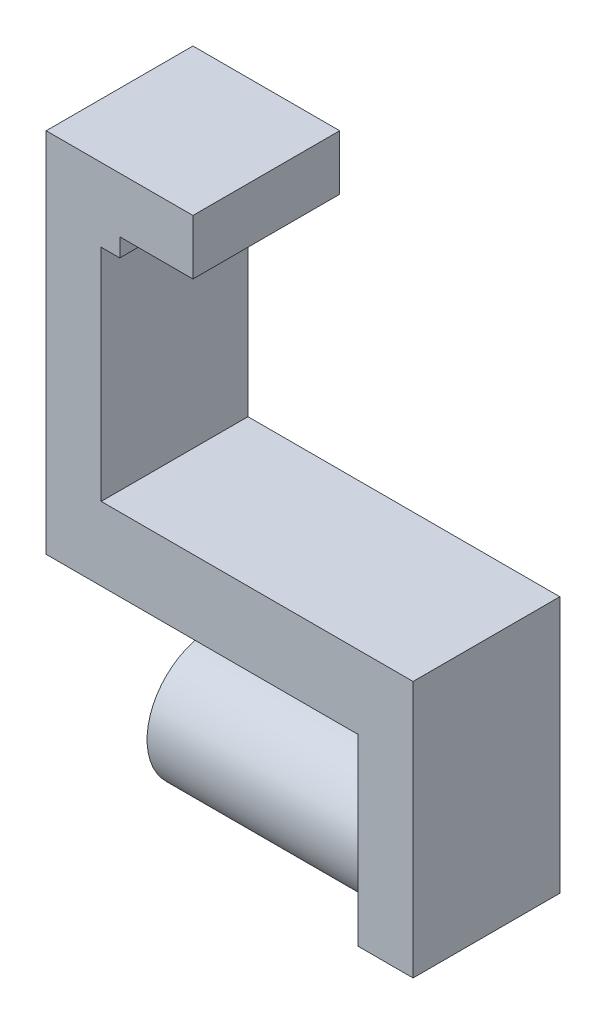
ISO-10303-21;
HEADER;
FILE_DESCRIPTION(('STEP AP214'),'2;1');
FILE_NAME('part.step','',(''),(''),'','','');
FILE_SCHEMA(('AUTOMOTIVE_DESIGN { 1 0 10303 214 1 1 1 1 }'));
ENDSEC;
DATA;
#1=APPLICATION_CONTEXT('core data for automotive mechanical design processes');
#2=APPLICATION_PROTOCOL_DEFINITION('international standard','automotive_design',2000,#1);
#3=PRODUCT_CONTEXT('',#1,'mechanical');
#4=PRODUCT('Part','Part','',(#3));
#5=PRODUCT_RELATED_PRODUCT_CATEGORY('part','',(#4));
#6=PRODUCT_DEFINITION_FORMATION('','',#4);
#7=PRODUCT_DEFINITION_CONTEXT('part definition',#1,'design');
#8=PRODUCT_DEFINITION('design','',#6,#7);
#9=PRODUCT_DEFINITION_SHAPE('','',#8);
#10=(LENGTH_UNIT() NAMED_UNIT(*) SI_UNIT(.MILLI.,.METRE.));
#11=(NAMED_UNIT(*) PLANE_ANGLE_UNIT() SI_UNIT($,.RADIAN.));
#12=(NAMED_UNIT(*) SI_UNIT($,.STERADIAN.) SOLID_ANGLE_UNIT());
#13=UNCERTAINTY_MEASURE_WITH_UNIT(LENGTH_MEASURE(1.E-05),#10,'distance_accuracy_value','');
#14=(GEOMETRIC_REPRESENTATION_CONTEXT(3) GLOBAL_UNCERTAINTY_ASSIGNED_CONTEXT((#13)) GLOBAL_UNIT_ASSIGNED_CONTEXT((#10,
#11,#12)) REPRESENTATION_CONTEXT('',''));
#15=CARTESIAN_POINT('',(0.,0.,0.));
#16=DIRECTION('',(0.,0.,1.));
#17=DIRECTION('',(1.,0.,0.));
#18=AXIS2_PLACEMENT_3D('',#15,#16,#17);
#19=CARTESIAN_POINT('',(-38.1,0.,0.));
#20=DIRECTION('',(1.,0.,0.));
#21=DIRECTION('',(0.,0.,-1.));
#22=AXIS2_PLACEMENT_3D('',#19,#20,#21);
#23=CYLINDRICAL_SURFACE('',#22,11.1125);
#24=CARTESIAN_POINT('',(-38.1,0.,0.));
#25=DIRECTION('',(1.,0.,0.));
#26=DIRECTION('',(0.,0.,-1.));
#27=AXIS2_PLACEMENT_3D('',#24,#25,#26);
#28=CIRCLE('',#27,11.1125);
#29=CARTESIAN_POINT('',(-38.1,0.,-11.1125));
#30=VERTEX_POINT('',#29);
#31=EDGE_CURVE('E237',#30,#30,#28,.T.);
#32=ORIENTED_EDGE('',*,*,#31,.T.);
#33=EDGE_LOOP('',(#32));
#34=FACE_BOUND('',#33,.T.);
#35=CARTESIAN_POINT('',(0.,0.,0.));
#36=DIRECTION('',(1.,0.,0.));
#37=DIRECTION('',(0.,0.,-1.));
#38=AXIS2_PLACEMENT_3D('',#35,#36,#37);
#39=CIRCLE('',#38,11.1125);
#40=CARTESIAN_POINT('',(0.,-11.1125,0.));
#41=VERTEX_POINT('',#40);
#42=EDGE_CURVE('E229',#41,#41,#39,.T.);
#43=ORIENTED_EDGE('',*,*,#42,.F.);
#44=EDGE_LOOP('',(#43));
#45=FACE_BOUND('',#44,.T.);
#46=ADVANCED_FACE('F50',(#34,#45),#23,.T.);
#47=CARTESIAN_POINT('',(-38.1,0.,0.));
#48=DIRECTION('',(1.,0.,0.));
#49=DIRECTION('',(0.,0.,-1.));
#50=AXIS2_PLACEMENT_3D('',#47,#48,#49);
#51=PLANE('',#50);
#52=ORIENTED_EDGE('',*,*,#31,.F.);
#53=EDGE_LOOP('',(#52));
#54=FACE_BOUND('',#53,.T.);
#55=ADVANCED_FACE('F277',(#54),#51,.F.);
#56=CARTESIAN_POINT('',(0.,-11.1125,-12.7));
#57=DIRECTION('',(-1.,0.,0.));
#58=DIRECTION('',(0.,0.,1.));
#59=AXIS2_PLACEMENT_3D('',#56,#57,#58);
#60=PLANE('',#59);
#61=DIRECTION('',(0.,0.,1.));
#62=VECTOR('',#61,1.);
#63=CARTESIAN_POINT('',(0.,-11.1125,-12.7));
#64=LINE('',#63,#62);
#65=CARTESIAN_POINT('',(0.,-11.1125,-12.7));
#66=VERTEX_POINT('',#65);
#67=EDGE_CURVE('E231',#66,#41,#64,.T.);
#68=ORIENTED_EDGE('',*,*,#67,.T.);
#69=ORIENTED_EDGE('',*,*,#42,.T.);
#70=CARTESIAN_POINT('',(0.,-11.1125,12.7));
#71=VERTEX_POINT('',#70);
#72=EDGE_CURVE('E228',#41,#71,#64,.T.);
#73=ORIENTED_EDGE('',*,*,#72,.T.);
#74=DIRECTION('',(0.,-1.,0.));
#75=VECTOR('',#74,1.);
#76=CARTESIAN_POINT('',(0.,-11.1125,12.7));
#77=LINE('',#76,#75);
#78=CARTESIAN_POINT('',(0.,20.6375,12.7));
#79=VERTEX_POINT('',#78);
#80=EDGE_CURVE('E208',#79,#71,#77,.T.);
#81=ORIENTED_EDGE('',*,*,#80,.F.);
#82=DIRECTION('',(0.,0.,1.));
#83=VECTOR('',#82,1.);
#84=CARTESIAN_POINT('',(0.,20.6375,-12.7));
#85=LINE('',#84,#83);
#86=CARTESIAN_POINT('',(0.,20.6375,-12.7));
#87=VERTEX_POINT('',#86);
#88=EDGE_CURVE('E230',#87,#79,#85,.T.);
#89=ORIENTED_EDGE('',*,*,#88,.F.);
#90=DIRECTION('',(0.,-1.,0.));
#91=VECTOR('',#90,1.);
#92=CARTESIAN_POINT('',(0.,-11.1125,-12.7));
#93=LINE('',#92,#91);
#94=EDGE_CURVE('E217',#87,#66,#93,.T.);
#95=ORIENTED_EDGE('',*,*,#94,.T.);
#96=EDGE_LOOP('',(#68,#69,#73,#81,#89,#95));
#97=FACE_BOUND('',#96,.T.);
#98=ADVANCED_FACE('F268',(#97),#60,.T.);
#99=CARTESIAN_POINT('',(9.525,-11.1125,-12.7));
#100=DIRECTION('',(1.,0.,0.));
#101=DIRECTION('',(0.,0.,-1.));
#102=AXIS2_PLACEMENT_3D('',#99,#100,#101);
#103=PLANE('',#102);
#104=DIRECTION('',(0.,1.,0.));
#105=VECTOR('',#104,1.);
#106=CARTESIAN_POINT('',(9.525,-11.1125,-12.7));
#107=LINE('',#106,#105);
#108=CARTESIAN_POINT('',(9.525,-11.1125,-12.7));
#109=VERTEX_POINT('',#108);
#110=CARTESIAN_POINT('',(9.525,33.3375,-12.7));
#111=VERTEX_POINT('',#110);
#112=EDGE_CURVE('E221',#109,#111,#107,.T.);
#113=ORIENTED_EDGE('',*,*,#112,.T.);
#114=DIRECTION('',(0.,0.,1.));
#115=VECTOR('',#114,1.);
#116=CARTESIAN_POINT('',(9.525,33.3375,-12.7));
#117=LINE('',#116,#115);
#118=CARTESIAN_POINT('',(9.525,33.3375,12.7));
#119=VERTEX_POINT('',#118);
#120=EDGE_CURVE('E202',#111,#119,#117,.T.);
#121=ORIENTED_EDGE('',*,*,#120,.T.);
#122=DIRECTION('',(0.,1.,0.));
#123=VECTOR('',#122,1.);
#124=CARTESIAN_POINT('',(9.525,-11.1125,12.7));
#125=LINE('',#124,#123);
#126=CARTESIAN_POINT('',(9.525,-11.1125,12.7));
#127=VERTEX_POINT('',#126);
#128=EDGE_CURVE('E216',#127,#119,#125,.T.);
#129=ORIENTED_EDGE('',*,*,#128,.F.);
#130=DIRECTION('',(0.,0.,1.));
#131=VECTOR('',#130,1.);
#132=CARTESIAN_POINT('',(9.525,-11.1125,-12.7));
#133=LINE('',#132,#131);
#134=EDGE_CURVE('E233',#109,#127,#133,.T.);
#135=ORIENTED_EDGE('',*,*,#134,.F.);
#136=EDGE_LOOP('',(#113,#121,#129,#135));
#137=FACE_BOUND('',#136,.T.);
#138=ADVANCED_FACE('F288',(#137),#103,.T.);
#139=CARTESIAN_POINT('',(0.,-11.1125,-12.7));
#140=DIRECTION('',(0.,-1.,0.));
#141=DIRECTION('',(0.,0.,-1.));
#142=AXIS2_PLACEMENT_3D('',#139,#140,#141);
#143=PLANE('',#142);
#144=ORIENTED_EDGE('',*,*,#134,.T.);
#145=DIRECTION('',(1.,0.,0.));
#146=VECTOR('',#145,1.);
#147=CARTESIAN_POINT('',(0.,-11.1125,12.7));
#148=LINE('',#147,#146);
#149=EDGE_CURVE('E213',#71,#127,#148,.T.);
#150=ORIENTED_EDGE('',*,*,#149,.F.);
#151=ORIENTED_EDGE('',*,*,#72,.F.);
#152=ORIENTED_EDGE('',*,*,#67,.F.);
#153=DIRECTION('',(1.,0.,0.));
#154=VECTOR('',#153,1.);
#155=CARTESIAN_POINT('',(0.,-11.1125,-12.7));
#156=LINE('',#155,#154);
#157=EDGE_CURVE('E222',#66,#109,#156,.T.);
#158=ORIENTED_EDGE('',*,*,#157,.T.);
#159=EDGE_LOOP('',(#144,#150,#151,#152,#158));
#160=FACE_BOUND('',#159,.T.);
#161=ADVANCED_FACE('F271',(#160),#143,.T.);
#162=CARTESIAN_POINT('',(0.,0.,-12.7));
#163=DIRECTION('',(0.,0.,-1.));
#164=DIRECTION('',(-1.,0.,0.));
#165=AXIS2_PLACEMENT_3D('',#162,#163,#164);
#166=PLANE('',#165);
#167=DIRECTION('',(-1.,0.,0.));
#168=VECTOR('',#167,1.);
#169=CARTESIAN_POINT('',(-53.975,84.1375,-12.7));
#170=LINE('',#169,#168);
#171=CARTESIAN_POINT('',(-28.575,84.1375,-12.7));
#172=VERTEX_POINT('',#171);
#173=CARTESIAN_POINT('',(-53.975,84.1375,-12.7));
#174=VERTEX_POINT('',#173);
#175=EDGE_CURVE('E188',#172,#174,#170,.T.);
#176=ORIENTED_EDGE('',*,*,#175,.F.);
#177=DIRECTION('',(0.,1.,0.));
#178=VECTOR('',#177,1.);
#179=CARTESIAN_POINT('',(-28.575,74.6125,-12.7));
#180=LINE('',#179,#178);
#181=CARTESIAN_POINT('',(-28.575,74.6125,-12.7));
#182=VERTEX_POINT('',#181);
#183=EDGE_CURVE('E156',#182,#172,#180,.T.);
#184=ORIENTED_EDGE('',*,*,#183,.F.);
#185=DIRECTION('',(1.,0.,0.));
#186=VECTOR('',#185,1.);
#187=CARTESIAN_POINT('',(-41.23944,74.6125,-12.7));
#188=LINE('',#187,#186);
#189=CARTESIAN_POINT('',(-41.23944,74.6125,-12.7));
#190=VERTEX_POINT('',#189);
#191=EDGE_CURVE('E166',#190,#182,#188,.T.);
#192=ORIENTED_EDGE('',*,*,#191,.F.);
#193=DIRECTION('',(0.,1.,0.));
#194=VECTOR('',#193,1.);
#195=CARTESIAN_POINT('',(-41.23944,71.4375,-12.7));
#196=LINE('',#195,#194);
#197=CARTESIAN_POINT('',(-41.23944,71.4375,-12.7));
#198=VERTEX_POINT('',#197);
#199=EDGE_CURVE('E170',#198,#190,#196,.T.);
#200=ORIENTED_EDGE('',*,*,#199,.F.);
#201=DIRECTION('',(1.,0.,0.));
#202=VECTOR('',#201,1.);
#203=CARTESIAN_POINT('',(-53.975,71.4375,-12.7));
#204=LINE('',#203,#202);
#205=CARTESIAN_POINT('',(-44.45,71.4375,-12.7));
#206=VERTEX_POINT('',#205);
#207=EDGE_CURVE('E151',#206,#198,#204,.T.);
#208=ORIENTED_EDGE('',*,*,#207,.F.);
#209=DIRECTION('',(0.,1.,0.));
#210=VECTOR('',#209,1.);
#211=CARTESIAN_POINT('',(-44.45,20.6375,-12.7));
#212=LINE('',#211,#210);
#213=CARTESIAN_POINT('',(-44.45,33.3375,-12.7));
#214=VERTEX_POINT('',#213);
#215=EDGE_CURVE('E184',#214,#206,#212,.T.);
#216=ORIENTED_EDGE('',*,*,#215,.F.);
#217=DIRECTION('',(-1.,0.,0.));
#218=VECTOR('',#217,1.);
#219=CARTESIAN_POINT('',(-53.975,33.3375,-12.7));
#220=LINE('',#219,#218);
#221=EDGE_CURVE('E205',#111,#214,#220,.T.);
#222=ORIENTED_EDGE('',*,*,#221,.F.);
#223=ORIENTED_EDGE('',*,*,#112,.F.);
#224=ORIENTED_EDGE('',*,*,#157,.F.);
#225=ORIENTED_EDGE('',*,*,#94,.F.);
#226=DIRECTION('',(1.,0.,0.));
#227=VECTOR('',#226,1.);
#228=CARTESIAN_POINT('',(-53.975,20.6375,-12.7));
#229=LINE('',#228,#227);
#230=CARTESIAN_POINT('',(-53.975,20.6375,-12.7));
#231=VERTEX_POINT('',#230);
#232=EDGE_CURVE('E199',#231,#87,#229,.T.);
#233=ORIENTED_EDGE('',*,*,#232,.F.);
#234=DIRECTION('',(0.,-1.,0.));
#235=VECTOR('',#234,1.);
#236=CARTESIAN_POINT('',(-53.975,20.6375,-12.7));
#237=LINE('',#236,#235);
#238=EDGE_CURVE('E196',#174,#231,#237,.T.);
#239=ORIENTED_EDGE('',*,*,#238,.F.);
#240=EDGE_LOOP('',(#176,#184,#192,#200,#208,#216,#222,#223,#224,#225,#233,#239));
#241=FACE_BOUND('',#240,.T.);
#242=ADVANCED_FACE('F242',(#241),#166,.T.);
#243=CARTESIAN_POINT('',(0.,0.,12.7));
#244=DIRECTION('',(0.,0.,-1.));
#245=DIRECTION('',(-1.,0.,0.));
#246=AXIS2_PLACEMENT_3D('',#243,#244,#245);
#247=PLANE('',#246);
#248=DIRECTION('',(0.,-1.,0.));
#249=VECTOR('',#248,1.);
#250=CARTESIAN_POINT('',(-53.975,20.6375,12.7));
#251=LINE('',#250,#249);
#252=CARTESIAN_POINT('',(-53.975,84.1375,12.7));
#253=VERTEX_POINT('',#252);
#254=CARTESIAN_POINT('',(-53.975,20.6375,12.7));
#255=VERTEX_POINT('',#254);
#256=EDGE_CURVE('E195',#253,#255,#251,.T.);
#257=ORIENTED_EDGE('',*,*,#256,.T.);
#258=DIRECTION('',(1.,0.,0.));
#259=VECTOR('',#258,1.);
#260=CARTESIAN_POINT('',(-53.975,20.6375,12.7));
#261=LINE('',#260,#259);
#262=EDGE_CURVE('E192',#255,#79,#261,.T.);
#263=ORIENTED_EDGE('',*,*,#262,.T.);
#264=ORIENTED_EDGE('',*,*,#80,.T.);
#265=ORIENTED_EDGE('',*,*,#149,.T.);
#266=ORIENTED_EDGE('',*,*,#128,.T.);
#267=DIRECTION('',(-1.,0.,0.));
#268=VECTOR('',#267,1.);
#269=CARTESIAN_POINT('',(-53.975,33.3375,12.7));
#270=LINE('',#269,#268);
#271=CARTESIAN_POINT('',(-44.45,33.3375,12.7));
#272=VERTEX_POINT('',#271);
#273=EDGE_CURVE('E198',#119,#272,#270,.T.);
#274=ORIENTED_EDGE('',*,*,#273,.T.);
#275=DIRECTION('',(0.,1.,0.));
#276=VECTOR('',#275,1.);
#277=CARTESIAN_POINT('',(-44.45,20.6375,12.7));
#278=LINE('',#277,#276);
#279=CARTESIAN_POINT('',(-44.45,71.4375,12.7));
#280=VERTEX_POINT('',#279);
#281=EDGE_CURVE('E145',#272,#280,#278,.T.);
#282=ORIENTED_EDGE('',*,*,#281,.T.);
#283=DIRECTION('',(1.,0.,0.));
#284=VECTOR('',#283,1.);
#285=CARTESIAN_POINT('',(-53.975,71.4375,12.7));
#286=LINE('',#285,#284);
#287=CARTESIAN_POINT('',(-41.23944,71.4375,12.7));
#288=VERTEX_POINT('',#287);
#289=EDGE_CURVE('E140',#280,#288,#286,.T.);
#290=ORIENTED_EDGE('',*,*,#289,.T.);
#291=DIRECTION('',(0.,1.,0.));
#292=VECTOR('',#291,1.);
#293=CARTESIAN_POINT('',(-41.23944,71.4375,12.7));
#294=LINE('',#293,#292);
#295=CARTESIAN_POINT('',(-41.23944,74.6125,12.7));
#296=VERTEX_POINT('',#295);
#297=EDGE_CURVE('E142',#288,#296,#294,.T.);
#298=ORIENTED_EDGE('',*,*,#297,.T.);
#299=DIRECTION('',(1.,0.,0.));
#300=VECTOR('',#299,1.);
#301=CARTESIAN_POINT('',(-41.23944,74.6125,12.7));
#302=LINE('',#301,#300);
#303=CARTESIAN_POINT('',(-28.575,74.6125,12.7));
#304=VERTEX_POINT('',#303);
#305=EDGE_CURVE('E157',#296,#304,#302,.T.);
#306=ORIENTED_EDGE('',*,*,#305,.T.);
#307=DIRECTION('',(0.,1.,0.));
#308=VECTOR('',#307,1.);
#309=CARTESIAN_POINT('',(-28.575,74.6125,12.7));
#310=LINE('',#309,#308);
#311=CARTESIAN_POINT('',(-28.575,84.1375,12.7));
#312=VERTEX_POINT('',#311);
#313=EDGE_CURVE('E161',#304,#312,#310,.T.);
#314=ORIENTED_EDGE('',*,*,#313,.T.);
#315=DIRECTION('',(-1.,0.,0.));
#316=VECTOR('',#315,1.);
#317=CARTESIAN_POINT('',(-53.975,84.1375,12.7));
#318=LINE('',#317,#316);
#319=EDGE_CURVE('E182',#312,#253,#318,.T.);
#320=ORIENTED_EDGE('',*,*,#319,.T.);
#321=EDGE_LOOP('',(#257,#263,#264,#265,#266,#274,#282,#290,#298,#306,#314,#320));
#322=FACE_BOUND('',#321,.T.);
#323=ADVANCED_FACE('F137',(#322),#247,.F.);
#324=CARTESIAN_POINT('',(-53.975,20.6375,-12.7));
#325=DIRECTION('',(-1.,0.,0.));
#326=DIRECTION('',(0.,0.,1.));
#327=AXIS2_PLACEMENT_3D('',#324,#325,#326);
#328=PLANE('',#327);
#329=DIRECTION('',(0.,0.,1.));
#330=VECTOR('',#329,1.);
#331=CARTESIAN_POINT('',(-53.975,20.6375,-12.7));
#332=LINE('',#331,#330);
#333=EDGE_CURVE('E204',#231,#255,#332,.T.);
#334=ORIENTED_EDGE('',*,*,#333,.T.);
#335=ORIENTED_EDGE('',*,*,#256,.F.);
#336=DIRECTION('',(0.,0.,1.));
#337=VECTOR('',#336,1.);
#338=CARTESIAN_POINT('',(-53.975,84.1375,-12.7));
#339=LINE('',#338,#337);
#340=EDGE_CURVE('E187',#174,#253,#339,.T.);
#341=ORIENTED_EDGE('',*,*,#340,.F.);
#342=ORIENTED_EDGE('',*,*,#238,.T.);
#343=EDGE_LOOP('',(#334,#335,#341,#342));
#344=FACE_BOUND('',#343,.T.);
#345=ADVANCED_FACE('F261',(#344),#328,.T.);
#346=CARTESIAN_POINT('',(-53.975,33.3375,-12.7));
#347=DIRECTION('',(0.,1.,0.));
#348=DIRECTION('',(0.,0.,1.));
#349=AXIS2_PLACEMENT_3D('',#346,#347,#348);
#350=PLANE('',#349);
#351=DIRECTION('',(0.,0.,-1.));
#352=VECTOR('',#351,1.);
#353=CARTESIAN_POINT('',(-44.45,33.3375,-12.7));
#354=LINE('',#353,#352);
#355=EDGE_CURVE('E53',#272,#214,#354,.T.);
#356=ORIENTED_EDGE('',*,*,#355,.F.);
#357=ORIENTED_EDGE('',*,*,#273,.F.);
#358=ORIENTED_EDGE('',*,*,#120,.F.);
#359=ORIENTED_EDGE('',*,*,#221,.T.);
#360=EDGE_LOOP('',(#356,#357,#358,#359));
#361=FACE_BOUND('',#360,.T.);
#362=ADVANCED_FACE('F297',(#361),#350,.T.);
#363=CARTESIAN_POINT('',(-53.975,20.6375,-12.7));
#364=DIRECTION('',(0.,-1.,0.));
#365=DIRECTION('',(0.,0.,-1.));
#366=AXIS2_PLACEMENT_3D('',#363,#364,#365);
#367=PLANE('',#366);
#368=ORIENTED_EDGE('',*,*,#88,.T.);
#369=ORIENTED_EDGE('',*,*,#262,.F.);
#370=ORIENTED_EDGE('',*,*,#333,.F.);
#371=ORIENTED_EDGE('',*,*,#232,.T.);
#372=EDGE_LOOP('',(#368,#369,#370,#371));
#373=FACE_BOUND('',#372,.T.);
#374=ADVANCED_FACE('F262',(#373),#367,.T.);
#375=CARTESIAN_POINT('',(-53.975,84.1375,-12.7));
#376=DIRECTION('',(0.,1.,0.));
#377=DIRECTION('',(0.,0.,1.));
#378=AXIS2_PLACEMENT_3D('',#375,#376,#377);
#379=PLANE('',#378);
#380=ORIENTED_EDGE('',*,*,#340,.T.);
#381=ORIENTED_EDGE('',*,*,#319,.F.);
#382=DIRECTION('',(0.,0.,1.));
#383=VECTOR('',#382,1.);
#384=CARTESIAN_POINT('',(-28.575,84.1375,-12.7));
#385=LINE('',#384,#383);
#386=EDGE_CURVE('E172',#172,#312,#385,.T.);
#387=ORIENTED_EDGE('',*,*,#386,.F.);
#388=ORIENTED_EDGE('',*,*,#175,.T.);
#389=EDGE_LOOP('',(#380,#381,#387,#388));
#390=FACE_BOUND('',#389,.T.);
#391=ADVANCED_FACE('F254',(#390),#379,.T.);
#392=CARTESIAN_POINT('',(-44.45,20.6375,-12.7));
#393=DIRECTION('',(1.,0.,0.));
#394=DIRECTION('',(0.,0.,-1.));
#395=AXIS2_PLACEMENT_3D('',#392,#393,#394);
#396=PLANE('',#395);
#397=DIRECTION('',(0.,0.,-1.));
#398=VECTOR('',#397,1.);
#399=CARTESIAN_POINT('',(-44.45,71.4375,-12.7));
#400=LINE('',#399,#398);
#401=EDGE_CURVE('E11',#280,#206,#400,.T.);
#402=ORIENTED_EDGE('',*,*,#401,.F.);
#403=ORIENTED_EDGE('',*,*,#281,.F.);
#404=ORIENTED_EDGE('',*,*,#355,.T.);
#405=ORIENTED_EDGE('',*,*,#215,.T.);
#406=EDGE_LOOP('',(#402,#403,#404,#405));
#407=FACE_BOUND('',#406,.T.);
#408=ADVANCED_FACE('F243',(#407),#396,.T.);
#409=CARTESIAN_POINT('',(-28.575,74.6125,-12.7));
#410=DIRECTION('',(1.,0.,0.));
#411=DIRECTION('',(0.,0.,-1.));
#412=AXIS2_PLACEMENT_3D('',#409,#410,#411);
#413=PLANE('',#412);
#414=ORIENTED_EDGE('',*,*,#386,.T.);
#415=ORIENTED_EDGE('',*,*,#313,.F.);
#416=DIRECTION('',(0.,0.,1.));
#417=VECTOR('',#416,1.);
#418=CARTESIAN_POINT('',(-28.575,74.6125,-12.7));
#419=LINE('',#418,#417);
#420=EDGE_CURVE('E180',#182,#304,#419,.T.);
#421=ORIENTED_EDGE('',*,*,#420,.F.);
#422=ORIENTED_EDGE('',*,*,#183,.T.);
#423=EDGE_LOOP('',(#414,#415,#421,#422));
#424=FACE_BOUND('',#423,.T.);
#425=ADVANCED_FACE('F252',(#424),#413,.T.);
#426=CARTESIAN_POINT('',(-41.23944,74.6125,-12.7));
#427=DIRECTION('',(0.,-1.,0.));
#428=DIRECTION('',(0.,0.,-1.));
#429=AXIS2_PLACEMENT_3D('',#426,#427,#428);
#430=PLANE('',#429);
#431=ORIENTED_EDGE('',*,*,#420,.T.);
#432=ORIENTED_EDGE('',*,*,#305,.F.);
#433=DIRECTION('',(0.,0.,1.));
#434=VECTOR('',#433,1.);
#435=CARTESIAN_POINT('',(-41.23944,74.6125,-12.7));
#436=LINE('',#435,#434);
#437=EDGE_CURVE('E154',#190,#296,#436,.T.);
#438=ORIENTED_EDGE('',*,*,#437,.F.);
#439=ORIENTED_EDGE('',*,*,#191,.T.);
#440=EDGE_LOOP('',(#431,#432,#438,#439));
#441=FACE_BOUND('',#440,.T.);
#442=ADVANCED_FACE('F247',(#441),#430,.T.);
#443=CARTESIAN_POINT('',(-41.23944,71.4375,-12.7));
#444=DIRECTION('',(1.,0.,0.));
#445=DIRECTION('',(0.,0.,-1.));
#446=AXIS2_PLACEMENT_3D('',#443,#444,#445);
#447=PLANE('',#446);
#448=ORIENTED_EDGE('',*,*,#437,.T.);
#449=ORIENTED_EDGE('',*,*,#297,.F.);
#450=DIRECTION('',(0.,0.,1.));
#451=VECTOR('',#450,1.);
#452=CARTESIAN_POINT('',(-41.23944,71.4375,-12.7));
#453=LINE('',#452,#451);
#454=EDGE_CURVE('E146',#198,#288,#453,.T.);
#455=ORIENTED_EDGE('',*,*,#454,.F.);
#456=ORIENTED_EDGE('',*,*,#199,.T.);
#457=EDGE_LOOP('',(#448,#449,#455,#456));
#458=FACE_BOUND('',#457,.T.);
#459=ADVANCED_FACE('F158',(#458),#447,.T.);
#460=CARTESIAN_POINT('',(-53.975,71.4375,-12.7));
#461=DIRECTION('',(0.,-1.,0.));
#462=DIRECTION('',(0.,0.,-1.));
#463=AXIS2_PLACEMENT_3D('',#460,#461,#462);
#464=PLANE('',#463);
#465=ORIENTED_EDGE('',*,*,#289,.F.);
#466=ORIENTED_EDGE('',*,*,#401,.T.);
#467=ORIENTED_EDGE('',*,*,#207,.T.);
#468=ORIENTED_EDGE('',*,*,#454,.T.);
#469=EDGE_LOOP('',(#465,#466,#467,#468));
#470=FACE_BOUND('',#469,.T.);
#471=ADVANCED_FACE('F149',(#470),#464,.T.);
#472=CLOSED_SHELL('',(#46,#55,#98,#138,#161,#242,#323,#345,#362,#374,#391,#408,#425,#442,#459,#471));
#473=MANIFOLD_SOLID_BREP('B2',#472);
#474=ADVANCED_BREP_SHAPE_REPRESENTATION('',(#18,#473),#14);
#475=SHAPE_DEFINITION_REPRESENTATION(#9,#474);
ENDSEC;
END-ISO-10303-21;
